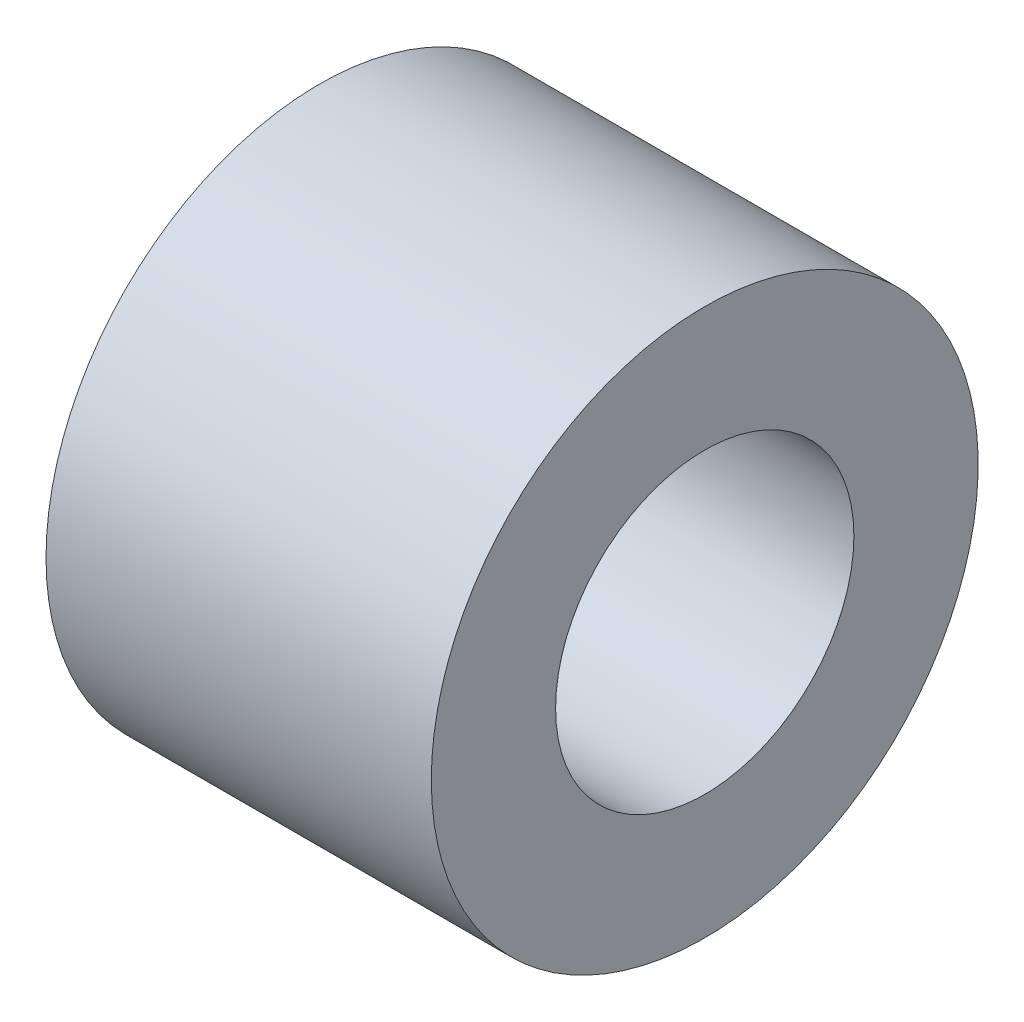
ISO-10303-21;
HEADER;
FILE_DESCRIPTION(('STEP AP214'),'2;1');
FILE_NAME('part.step','',(''),(''),'','','');
FILE_SCHEMA(('AUTOMOTIVE_DESIGN { 1 0 10303 214 1 1 1 1 }'));
ENDSEC;
DATA;
#1=APPLICATION_CONTEXT('core data for automotive mechanical design processes');
#2=APPLICATION_PROTOCOL_DEFINITION('international standard','automotive_design',2000,#1);
#3=PRODUCT_CONTEXT('',#1,'mechanical');
#4=PRODUCT('Part','Part','',(#3));
#5=PRODUCT_RELATED_PRODUCT_CATEGORY('part','',(#4));
#6=PRODUCT_DEFINITION_FORMATION('','',#4);
#7=PRODUCT_DEFINITION_CONTEXT('part definition',#1,'design');
#8=PRODUCT_DEFINITION('design','',#6,#7);
#9=PRODUCT_DEFINITION_SHAPE('','',#8);
#10=(LENGTH_UNIT() NAMED_UNIT(*) SI_UNIT(.MILLI.,.METRE.));
#11=(NAMED_UNIT(*) PLANE_ANGLE_UNIT() SI_UNIT($,.RADIAN.));
#12=(NAMED_UNIT(*) SI_UNIT($,.STERADIAN.) SOLID_ANGLE_UNIT());
#13=UNCERTAINTY_MEASURE_WITH_UNIT(LENGTH_MEASURE(1.E-05),#10,'distance_accuracy_value','');
#14=(GEOMETRIC_REPRESENTATION_CONTEXT(3) GLOBAL_UNCERTAINTY_ASSIGNED_CONTEXT((#13)) GLOBAL_UNIT_ASSIGNED_CONTEXT((#10,
#11,#12)) REPRESENTATION_CONTEXT('',''));
#15=CARTESIAN_POINT('',(0.,0.,0.));
#16=DIRECTION('',(0.,0.,1.));
#17=DIRECTION('',(1.,0.,0.));
#18=AXIS2_PLACEMENT_3D('',#15,#16,#17);
#19=CARTESIAN_POINT('',(0.,0.,0.));
#20=DIRECTION('',(-1.,0.,0.));
#21=DIRECTION('',(0.,0.,1.));
#22=AXIS2_PLACEMENT_3D('',#19,#20,#21);
#23=CYLINDRICAL_SURFACE('',#22,11.);
#24=CARTESIAN_POINT('',(15.5,0.,0.));
#25=DIRECTION('',(-1.,0.,0.));
#26=DIRECTION('',(0.,0.,1.));
#27=AXIS2_PLACEMENT_3D('',#24,#25,#26);
#28=CIRCLE('',#27,11.);
#29=CARTESIAN_POINT('',(15.5,0.,11.));
#30=VERTEX_POINT('',#29);
#31=EDGE_CURVE('E10',#30,#30,#28,.T.);
#32=ORIENTED_EDGE('',*,*,#31,.T.);
#33=EDGE_LOOP('',(#32));
#34=FACE_BOUND('',#33,.T.);
#35=CARTESIAN_POINT('',(0.,0.,0.));
#36=DIRECTION('',(-1.,0.,0.));
#37=DIRECTION('',(0.,0.,1.));
#38=AXIS2_PLACEMENT_3D('',#35,#36,#37);
#39=CIRCLE('',#38,11.);
#40=CARTESIAN_POINT('',(0.,0.,11.));
#41=VERTEX_POINT('',#40);
#42=EDGE_CURVE('E48',#41,#41,#39,.T.);
#43=ORIENTED_EDGE('',*,*,#42,.F.);
#44=EDGE_LOOP('',(#43));
#45=FACE_BOUND('',#44,.T.);
#46=ADVANCED_FACE('F34',(#34,#45),#23,.T.);
#47=CARTESIAN_POINT('',(15.5,0.,0.));
#48=DIRECTION('',(1.,0.,0.));
#49=DIRECTION('',(0.,0.,-1.));
#50=AXIS2_PLACEMENT_3D('',#47,#48,#49);
#51=PLANE('',#50);
#52=CARTESIAN_POINT('',(15.5,0.,0.));
#53=DIRECTION('',(-1.,0.,0.));
#54=DIRECTION('',(0.,0.,1.));
#55=AXIS2_PLACEMENT_3D('',#52,#53,#54);
#56=CIRCLE('',#55,6.);
#57=CARTESIAN_POINT('',(15.5,0.,6.));
#58=VERTEX_POINT('',#57);
#59=EDGE_CURVE('E40',#58,#58,#56,.T.);
#60=ORIENTED_EDGE('',*,*,#59,.T.);
#61=EDGE_LOOP('',(#60));
#62=FACE_BOUND('',#61,.T.);
#63=ORIENTED_EDGE('',*,*,#31,.F.);
#64=EDGE_LOOP('',(#63));
#65=FACE_BOUND('',#64,.T.);
#66=ADVANCED_FACE('F58',(#62,#65),#51,.T.);
#67=CARTESIAN_POINT('',(0.,0.,0.));
#68=DIRECTION('',(-1.,0.,0.));
#69=DIRECTION('',(0.,0.,1.));
#70=AXIS2_PLACEMENT_3D('',#67,#68,#69);
#71=CYLINDRICAL_SURFACE('',#70,6.);
#72=ORIENTED_EDGE('',*,*,#59,.F.);
#73=EDGE_LOOP('',(#72));
#74=FACE_BOUND('',#73,.T.);
#75=CARTESIAN_POINT('',(0.,0.,0.));
#76=DIRECTION('',(-1.,0.,0.));
#77=DIRECTION('',(0.,0.,1.));
#78=AXIS2_PLACEMENT_3D('',#75,#76,#77);
#79=CIRCLE('',#78,6.);
#80=CARTESIAN_POINT('',(0.,0.,6.));
#81=VERTEX_POINT('',#80);
#82=EDGE_CURVE('E44',#81,#81,#79,.T.);
#83=ORIENTED_EDGE('',*,*,#82,.T.);
#84=EDGE_LOOP('',(#83));
#85=FACE_BOUND('',#84,.T.);
#86=ADVANCED_FACE('F62',(#74,#85),#71,.F.);
#87=CARTESIAN_POINT('',(0.,0.,0.));
#88=DIRECTION('',(-1.,0.,0.));
#89=DIRECTION('',(0.,0.,1.));
#90=AXIS2_PLACEMENT_3D('',#87,#88,#89);
#91=PLANE('',#90);
#92=ORIENTED_EDGE('',*,*,#42,.T.);
#93=EDGE_LOOP('',(#92));
#94=FACE_BOUND('',#93,.T.);
#95=ORIENTED_EDGE('',*,*,#82,.F.);
#96=EDGE_LOOP('',(#95));
#97=FACE_BOUND('',#96,.T.);
#98=ADVANCED_FACE('F54',(#94,#97),#91,.T.);
#99=CLOSED_SHELL('',(#46,#66,#86,#98));
#100=MANIFOLD_SOLID_BREP('B2',#99);
#101=ADVANCED_BREP_SHAPE_REPRESENTATION('',(#18,#100),#14);
#102=SHAPE_DEFINITION_REPRESENTATION(#9,#101);
ENDSEC;
END-ISO-10303-21;
